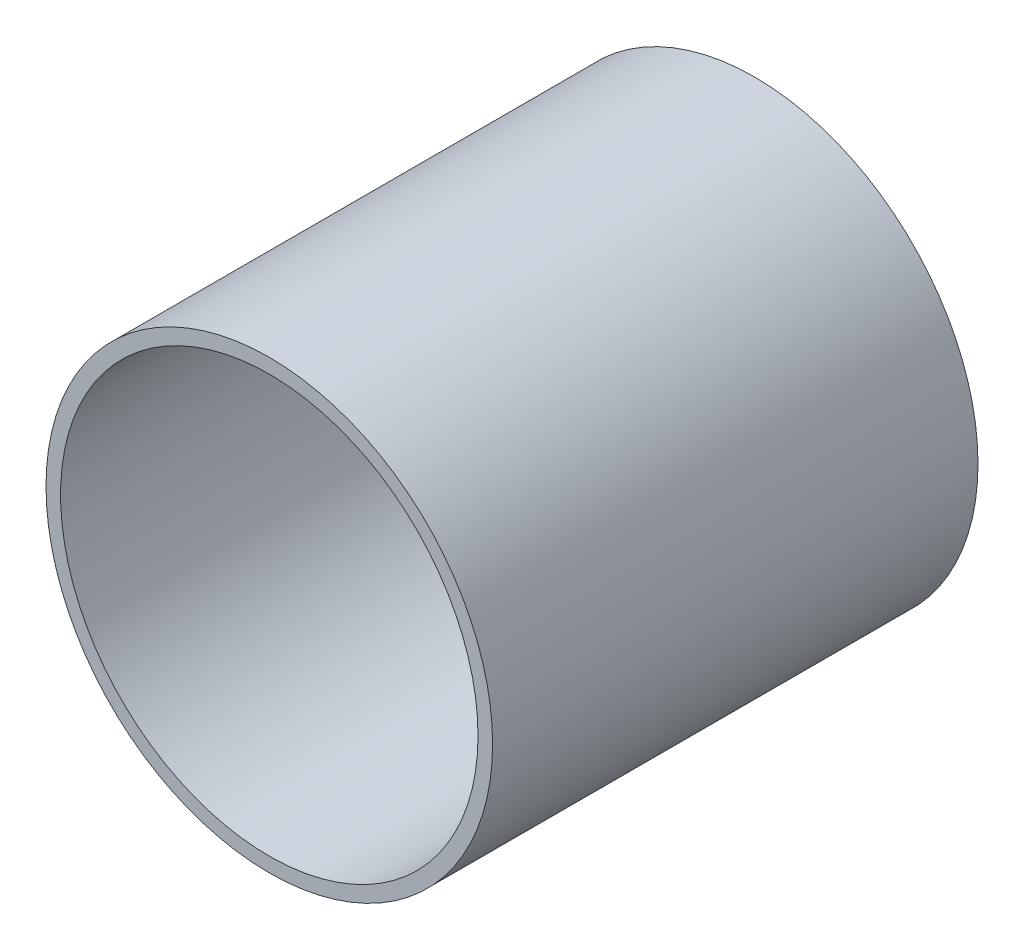
ISO-10303-21;
HEADER;
FILE_DESCRIPTION(('STEP AP214'),'2;1');
FILE_NAME('part.step','',(''),(''),'','','');
FILE_SCHEMA(('AUTOMOTIVE_DESIGN { 1 0 10303 214 1 1 1 1 }'));
ENDSEC;
DATA;
#1=APPLICATION_CONTEXT('core data for automotive mechanical design processes');
#2=APPLICATION_PROTOCOL_DEFINITION('international standard','automotive_design',2000,#1);
#3=PRODUCT_CONTEXT('',#1,'mechanical');
#4=PRODUCT('Part','Part','',(#3));
#5=PRODUCT_RELATED_PRODUCT_CATEGORY('part','',(#4));
#6=PRODUCT_DEFINITION_FORMATION('','',#4);
#7=PRODUCT_DEFINITION_CONTEXT('part definition',#1,'design');
#8=PRODUCT_DEFINITION('design','',#6,#7);
#9=PRODUCT_DEFINITION_SHAPE('','',#8);
#10=(LENGTH_UNIT() NAMED_UNIT(*) SI_UNIT(.MILLI.,.METRE.));
#11=(NAMED_UNIT(*) PLANE_ANGLE_UNIT() SI_UNIT($,.RADIAN.));
#12=(NAMED_UNIT(*) SI_UNIT($,.STERADIAN.) SOLID_ANGLE_UNIT());
#13=UNCERTAINTY_MEASURE_WITH_UNIT(LENGTH_MEASURE(1.E-05),#10,'distance_accuracy_value','');
#14=(GEOMETRIC_REPRESENTATION_CONTEXT(3) GLOBAL_UNCERTAINTY_ASSIGNED_CONTEXT((#13)) GLOBAL_UNIT_ASSIGNED_CONTEXT((#10,
#11,#12)) REPRESENTATION_CONTEXT('',''));
#15=CARTESIAN_POINT('',(0.,0.,0.));
#16=DIRECTION('',(0.,0.,1.));
#17=DIRECTION('',(1.,0.,0.));
#18=AXIS2_PLACEMENT_3D('',#15,#16,#17);
#19=CARTESIAN_POINT('',(0.,0.,50.));
#20=DIRECTION('',(0.,0.,1.));
#21=DIRECTION('',(1.,0.,0.));
#22=AXIS2_PLACEMENT_3D('',#19,#20,#21);
#23=PLANE('',#22);
#24=CARTESIAN_POINT('',(0.,0.,50.));
#25=DIRECTION('',(0.,0.,1.));
#26=DIRECTION('',(1.,0.,0.));
#27=AXIS2_PLACEMENT_3D('',#24,#25,#26);
#28=CIRCLE('',#27,23.);
#29=CARTESIAN_POINT('',(23.,0.,50.));
#30=VERTEX_POINT('',#29);
#31=EDGE_CURVE('E10',#30,#30,#28,.T.);
#32=ORIENTED_EDGE('',*,*,#31,.T.);
#33=EDGE_LOOP('',(#32));
#34=FACE_BOUND('',#33,.T.);
#35=CARTESIAN_POINT('',(0.,0.,50.));
#36=DIRECTION('',(0.,0.,1.));
#37=DIRECTION('',(1.,0.,0.));
#38=AXIS2_PLACEMENT_3D('',#35,#36,#37);
#39=CIRCLE('',#38,21.5);
#40=CARTESIAN_POINT('',(21.5,0.,50.));
#41=VERTEX_POINT('',#40);
#42=EDGE_CURVE('E50',#41,#41,#39,.T.);
#43=ORIENTED_EDGE('',*,*,#42,.F.);
#44=EDGE_LOOP('',(#43));
#45=FACE_BOUND('',#44,.T.);
#46=ADVANCED_FACE('F37',(#34,#45),#23,.T.);
#47=CARTESIAN_POINT('',(0.,0.,0.));
#48=DIRECTION('',(0.,0.,1.));
#49=DIRECTION('',(1.,0.,0.));
#50=AXIS2_PLACEMENT_3D('',#47,#48,#49);
#51=PLANE('',#50);
#52=CARTESIAN_POINT('',(0.,0.,0.));
#53=DIRECTION('',(0.,0.,1.));
#54=DIRECTION('',(1.,0.,0.));
#55=AXIS2_PLACEMENT_3D('',#52,#53,#54);
#56=CIRCLE('',#55,23.);
#57=CARTESIAN_POINT('',(23.,0.,0.));
#58=VERTEX_POINT('',#57);
#59=EDGE_CURVE('E41',#58,#58,#56,.T.);
#60=ORIENTED_EDGE('',*,*,#59,.F.);
#61=EDGE_LOOP('',(#60));
#62=FACE_BOUND('',#61,.T.);
#63=CARTESIAN_POINT('',(0.,0.,0.));
#64=DIRECTION('',(0.,0.,1.));
#65=DIRECTION('',(1.,0.,0.));
#66=AXIS2_PLACEMENT_3D('',#63,#64,#65);
#67=CIRCLE('',#66,21.5);
#68=CARTESIAN_POINT('',(21.5,0.,0.));
#69=VERTEX_POINT('',#68);
#70=EDGE_CURVE('E52',#69,#69,#67,.T.);
#71=ORIENTED_EDGE('',*,*,#70,.T.);
#72=EDGE_LOOP('',(#71));
#73=FACE_BOUND('',#72,.T.);
#74=ADVANCED_FACE('F64',(#62,#73),#51,.F.);
#75=CARTESIAN_POINT('',(0.,0.,50.));
#76=DIRECTION('',(0.,0.,-1.));
#77=DIRECTION('',(-1.,0.,0.));
#78=AXIS2_PLACEMENT_3D('',#75,#76,#77);
#79=CYLINDRICAL_SURFACE('',#78,23.);
#80=ORIENTED_EDGE('',*,*,#31,.F.);
#81=EDGE_LOOP('',(#80));
#82=FACE_BOUND('',#81,.T.);
#83=ORIENTED_EDGE('',*,*,#59,.T.);
#84=EDGE_LOOP('',(#83));
#85=FACE_BOUND('',#84,.T.);
#86=ADVANCED_FACE('F39',(#82,#85),#79,.T.);
#87=CARTESIAN_POINT('',(0.,0.,50.));
#88=DIRECTION('',(0.,0.,-1.));
#89=DIRECTION('',(-1.,0.,0.));
#90=AXIS2_PLACEMENT_3D('',#87,#88,#89);
#91=CYLINDRICAL_SURFACE('',#90,21.5);
#92=ORIENTED_EDGE('',*,*,#42,.T.);
#93=EDGE_LOOP('',(#92));
#94=FACE_BOUND('',#93,.T.);
#95=ORIENTED_EDGE('',*,*,#70,.F.);
#96=EDGE_LOOP('',(#95));
#97=FACE_BOUND('',#96,.T.);
#98=ADVANCED_FACE('F60',(#94,#97),#91,.F.);
#99=CLOSED_SHELL('',(#46,#74,#86,#98));
#100=MANIFOLD_SOLID_BREP('B2',#99);
#101=ADVANCED_BREP_SHAPE_REPRESENTATION('',(#18,#100),#14);
#102=SHAPE_DEFINITION_REPRESENTATION(#9,#101);
ENDSEC;
END-ISO-10303-21;
